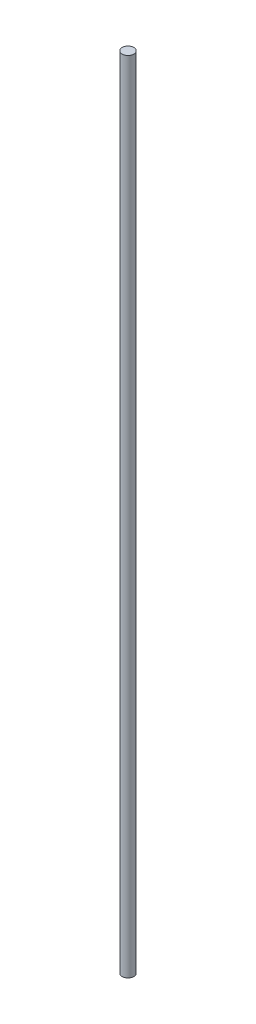
ISO-10303-21;
HEADER;
FILE_DESCRIPTION(('STEP AP214'),'2;1');
FILE_NAME('part.step','',(''),(''),'','','');
FILE_SCHEMA(('AUTOMOTIVE_DESIGN { 1 0 10303 214 1 1 1 1 }'));
ENDSEC;
DATA;
#1=APPLICATION_CONTEXT('core data for automotive mechanical design processes');
#2=APPLICATION_PROTOCOL_DEFINITION('international standard','automotive_design',2000,#1);
#3=PRODUCT_CONTEXT('',#1,'mechanical');
#4=PRODUCT('Part','Part','',(#3));
#5=PRODUCT_RELATED_PRODUCT_CATEGORY('part','',(#4));
#6=PRODUCT_DEFINITION_FORMATION('','',#4);
#7=PRODUCT_DEFINITION_CONTEXT('part definition',#1,'design');
#8=PRODUCT_DEFINITION('design','',#6,#7);
#9=PRODUCT_DEFINITION_SHAPE('','',#8);
#10=(LENGTH_UNIT() NAMED_UNIT(*) SI_UNIT(.MILLI.,.METRE.));
#11=(NAMED_UNIT(*) PLANE_ANGLE_UNIT() SI_UNIT($,.RADIAN.));
#12=(NAMED_UNIT(*) SI_UNIT($,.STERADIAN.) SOLID_ANGLE_UNIT());
#13=UNCERTAINTY_MEASURE_WITH_UNIT(LENGTH_MEASURE(1.E-05),#10,'distance_accuracy_value','');
#14=(GEOMETRIC_REPRESENTATION_CONTEXT(3) GLOBAL_UNCERTAINTY_ASSIGNED_CONTEXT((#13)) GLOBAL_UNIT_ASSIGNED_CONTEXT((#10,
#11,#12)) REPRESENTATION_CONTEXT('',''));
#15=CARTESIAN_POINT('',(0.,0.,0.));
#16=DIRECTION('',(0.,0.,1.));
#17=DIRECTION('',(1.,0.,0.));
#18=AXIS2_PLACEMENT_3D('',#15,#16,#17);
#19=CARTESIAN_POINT('',(0.,550.,0.));
#20=DIRECTION('',(0.,-1.,0.));
#21=DIRECTION('',(0.,0.,-1.));
#22=AXIS2_PLACEMENT_3D('',#19,#20,#21);
#23=CYLINDRICAL_SURFACE('',#22,4.);
#24=CARTESIAN_POINT('',(0.,550.,0.));
#25=DIRECTION('',(0.,1.,0.));
#26=DIRECTION('',(0.,0.,1.));
#27=AXIS2_PLACEMENT_3D('',#24,#25,#26);
#28=CIRCLE('',#27,4.);
#29=CARTESIAN_POINT('',(0.,550.,4.));
#30=VERTEX_POINT('',#29);
#31=EDGE_CURVE('E10',#30,#30,#28,.T.);
#32=ORIENTED_EDGE('',*,*,#31,.F.);
#33=EDGE_LOOP('',(#32));
#34=FACE_BOUND('',#33,.T.);
#35=CARTESIAN_POINT('',(0.,0.,0.));
#36=DIRECTION('',(0.,1.,0.));
#37=DIRECTION('',(0.,0.,1.));
#38=AXIS2_PLACEMENT_3D('',#35,#36,#37);
#39=CIRCLE('',#38,4.);
#40=CARTESIAN_POINT('',(0.,0.,4.));
#41=VERTEX_POINT('',#40);
#42=EDGE_CURVE('E40',#41,#41,#39,.T.);
#43=ORIENTED_EDGE('',*,*,#42,.T.);
#44=EDGE_LOOP('',(#43));
#45=FACE_BOUND('',#44,.T.);
#46=ADVANCED_FACE('F37',(#34,#45),#23,.T.);
#47=CARTESIAN_POINT('',(0.,550.,0.));
#48=DIRECTION('',(0.,1.,0.));
#49=DIRECTION('',(0.,0.,1.));
#50=AXIS2_PLACEMENT_3D('',#47,#48,#49);
#51=PLANE('',#50);
#52=ORIENTED_EDGE('',*,*,#31,.T.);
#53=EDGE_LOOP('',(#52));
#54=FACE_BOUND('',#53,.T.);
#55=ADVANCED_FACE('F54',(#54),#51,.T.);
#56=CARTESIAN_POINT('',(0.,0.,0.));
#57=DIRECTION('',(0.,1.,0.));
#58=DIRECTION('',(0.,0.,1.));
#59=AXIS2_PLACEMENT_3D('',#56,#57,#58);
#60=PLANE('',#59);
#61=ORIENTED_EDGE('',*,*,#42,.F.);
#62=EDGE_LOOP('',(#61));
#63=FACE_BOUND('',#62,.T.);
#64=ADVANCED_FACE('F52',(#63),#60,.F.);
#65=CLOSED_SHELL('',(#46,#55,#64));
#66=MANIFOLD_SOLID_BREP('B2',#65);
#67=ADVANCED_BREP_SHAPE_REPRESENTATION('',(#18,#66),#14);
#68=SHAPE_DEFINITION_REPRESENTATION(#9,#67);
ENDSEC;
END-ISO-10303-21;
